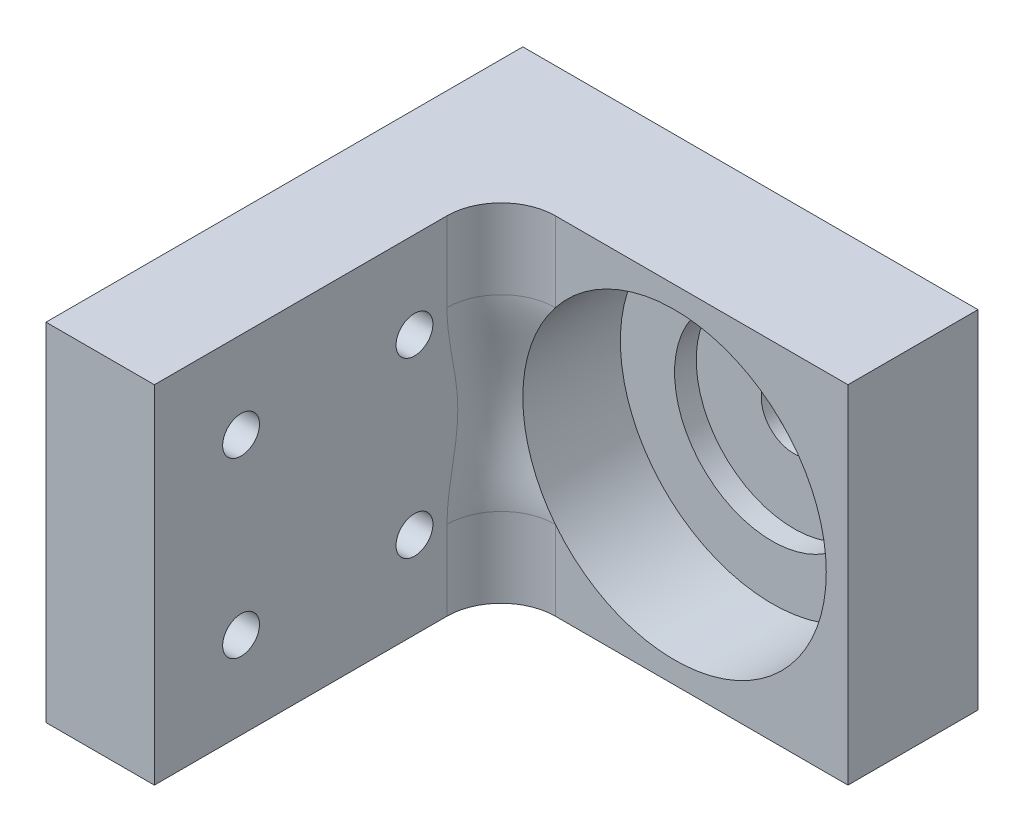
ISO-10303-21;
HEADER;
FILE_DESCRIPTION(('STEP AP214'),'2;1');
FILE_NAME('part.step','',(''),(''),'','','');
FILE_SCHEMA(('AUTOMOTIVE_DESIGN { 1 0 10303 214 1 1 1 1 }'));
ENDSEC;
DATA;
#1=APPLICATION_CONTEXT('core data for automotive mechanical design processes');
#2=APPLICATION_PROTOCOL_DEFINITION('international standard','automotive_design',2000,#1);
#3=PRODUCT_CONTEXT('',#1,'mechanical');
#4=PRODUCT('Part','Part','',(#3));
#5=PRODUCT_RELATED_PRODUCT_CATEGORY('part','',(#4));
#6=PRODUCT_DEFINITION_FORMATION('','',#4);
#7=PRODUCT_DEFINITION_CONTEXT('part definition',#1,'design');
#8=PRODUCT_DEFINITION('design','',#6,#7);
#9=PRODUCT_DEFINITION_SHAPE('','',#8);
#10=(LENGTH_UNIT() NAMED_UNIT(*) SI_UNIT(.MILLI.,.METRE.));
#11=(NAMED_UNIT(*) PLANE_ANGLE_UNIT() SI_UNIT($,.RADIAN.));
#12=(NAMED_UNIT(*) SI_UNIT($,.STERADIAN.) SOLID_ANGLE_UNIT());
#13=UNCERTAINTY_MEASURE_WITH_UNIT(LENGTH_MEASURE(1.E-05),#10,'distance_accuracy_value','');
#14=(GEOMETRIC_REPRESENTATION_CONTEXT(3) GLOBAL_UNCERTAINTY_ASSIGNED_CONTEXT((#13)) GLOBAL_UNIT_ASSIGNED_CONTEXT((#10,
#11,#12)) REPRESENTATION_CONTEXT('',''));
#15=CARTESIAN_POINT('',(0.,0.,0.));
#16=DIRECTION('',(0.,0.,1.));
#17=DIRECTION('',(1.,0.,0.));
#18=AXIS2_PLACEMENT_3D('',#15,#16,#17);
#19=CARTESIAN_POINT('',(0.,0.,12.));
#20=DIRECTION('',(0.,1.,0.));
#21=DIRECTION('',(0.,0.,1.));
#22=AXIS2_PLACEMENT_3D('',#19,#20,#21);
#23=PLANE('',#22);
#24=DIRECTION('',(1.,0.,0.));
#25=VECTOR('',#24,1.);
#26=CARTESIAN_POINT('',(0.,0.,0.));
#27=LINE('',#26,#25);
#28=CARTESIAN_POINT('',(-10.,0.,0.));
#29=VERTEX_POINT('',#28);
#30=CARTESIAN_POINT('',(32.,0.,0.));
#31=VERTEX_POINT('',#30);
#32=EDGE_CURVE('E126',#29,#31,#27,.T.);
#33=ORIENTED_EDGE('',*,*,#32,.T.);
#34=DIRECTION('',(0.,0.,-1.));
#35=VECTOR('',#34,1.);
#36=CARTESIAN_POINT('',(32.,0.,12.));
#37=LINE('',#36,#35);
#38=CARTESIAN_POINT('',(32.,0.,12.));
#39=VERTEX_POINT('',#38);
#40=EDGE_CURVE('E224',#39,#31,#37,.T.);
#41=ORIENTED_EDGE('',*,*,#40,.F.);
#42=DIRECTION('',(1.,0.,0.));
#43=VECTOR('',#42,1.);
#44=CARTESIAN_POINT('',(0.,0.,12.));
#45=LINE('',#44,#43);
#46=CARTESIAN_POINT('',(5.,0.,12.));
#47=VERTEX_POINT('',#46);
#48=EDGE_CURVE('E205',#47,#39,#45,.T.);
#49=ORIENTED_EDGE('',*,*,#48,.F.);
#50=CARTESIAN_POINT('',(5.,0.,17.));
#51=DIRECTION('',(0.,1.,0.));
#52=DIRECTION('',(0.,0.,1.));
#53=AXIS2_PLACEMENT_3D('',#50,#51,#52);
#54=CIRCLE('',#53,5.);
#55=CARTESIAN_POINT('',(0.,0.,17.));
#56=VERTEX_POINT('',#55);
#57=EDGE_CURVE('E63',#47,#56,#54,.T.);
#58=ORIENTED_EDGE('',*,*,#57,.T.);
#59=DIRECTION('',(0.,0.,1.));
#60=VECTOR('',#59,1.);
#61=CARTESIAN_POINT('',(0.,0.,0.));
#62=LINE('',#61,#60);
#63=CARTESIAN_POINT('',(0.,0.,44.));
#64=VERTEX_POINT('',#63);
#65=EDGE_CURVE('E170',#56,#64,#62,.T.);
#66=ORIENTED_EDGE('',*,*,#65,.T.);
#67=DIRECTION('',(1.,0.,0.));
#68=VECTOR('',#67,1.);
#69=CARTESIAN_POINT('',(-10.,0.,44.));
#70=LINE('',#69,#68);
#71=CARTESIAN_POINT('',(-10.,0.,44.));
#72=VERTEX_POINT('',#71);
#73=EDGE_CURVE('E142',#72,#64,#70,.T.);
#74=ORIENTED_EDGE('',*,*,#73,.F.);
#75=DIRECTION('',(0.,0.,1.));
#76=VECTOR('',#75,1.);
#77=CARTESIAN_POINT('',(-10.,0.,0.));
#78=LINE('',#77,#76);
#79=EDGE_CURVE('E140',#29,#72,#78,.T.);
#80=ORIENTED_EDGE('',*,*,#79,.F.);
#81=EDGE_LOOP('',(#33,#41,#49,#58,#66,#74,#80));
#82=FACE_BOUND('',#81,.T.);
#83=ADVANCED_FACE('F48',(#82),#23,.F.);
#84=CARTESIAN_POINT('',(32.,0.,12.));
#85=DIRECTION('',(-1.,0.,0.));
#86=DIRECTION('',(0.,0.,1.));
#87=AXIS2_PLACEMENT_3D('',#84,#85,#86);
#88=PLANE('',#87);
#89=DIRECTION('',(0.,1.,0.));
#90=VECTOR('',#89,1.);
#91=CARTESIAN_POINT('',(32.,0.,0.));
#92=LINE('',#91,#90);
#93=CARTESIAN_POINT('',(32.,32.,0.));
#94=VERTEX_POINT('',#93);
#95=EDGE_CURVE('E132',#31,#94,#92,.T.);
#96=ORIENTED_EDGE('',*,*,#95,.T.);
#97=DIRECTION('',(0.,0.,-1.));
#98=VECTOR('',#97,1.);
#99=CARTESIAN_POINT('',(32.,32.,12.));
#100=LINE('',#99,#98);
#101=CARTESIAN_POINT('',(32.,32.,12.));
#102=VERTEX_POINT('',#101);
#103=EDGE_CURVE('E215',#102,#94,#100,.T.);
#104=ORIENTED_EDGE('',*,*,#103,.F.);
#105=DIRECTION('',(0.,1.,0.));
#106=VECTOR('',#105,1.);
#107=CARTESIAN_POINT('',(32.,0.,12.));
#108=LINE('',#107,#106);
#109=EDGE_CURVE('E208',#39,#102,#108,.T.);
#110=ORIENTED_EDGE('',*,*,#109,.F.);
#111=ORIENTED_EDGE('',*,*,#40,.T.);
#112=EDGE_LOOP('',(#96,#104,#110,#111));
#113=FACE_BOUND('',#112,.T.);
#114=ADVANCED_FACE('F436',(#113),#88,.F.);
#115=CARTESIAN_POINT('',(0.,32.,12.));
#116=DIRECTION('',(0.,-1.,0.));
#117=DIRECTION('',(0.,0.,-1.));
#118=AXIS2_PLACEMENT_3D('',#115,#116,#117);
#119=PLANE('',#118);
#120=DIRECTION('',(-1.,0.,0.));
#121=VECTOR('',#120,1.);
#122=CARTESIAN_POINT('',(0.,32.,0.));
#123=LINE('',#122,#121);
#124=CARTESIAN_POINT('',(-10.,32.,0.));
#125=VERTEX_POINT('',#124);
#126=EDGE_CURVE('E209',#94,#125,#123,.T.);
#127=ORIENTED_EDGE('',*,*,#126,.T.);
#128=DIRECTION('',(0.,0.,-1.));
#129=VECTOR('',#128,1.);
#130=CARTESIAN_POINT('',(-10.,32.,0.));
#131=LINE('',#130,#129);
#132=CARTESIAN_POINT('',(-10.,32.,44.));
#133=VERTEX_POINT('',#132);
#134=EDGE_CURVE('E151',#133,#125,#131,.T.);
#135=ORIENTED_EDGE('',*,*,#134,.F.);
#136=DIRECTION('',(1.,0.,0.));
#137=VECTOR('',#136,1.);
#138=CARTESIAN_POINT('',(-10.,32.,44.));
#139=LINE('',#138,#137);
#140=CARTESIAN_POINT('',(0.,32.,44.));
#141=VERTEX_POINT('',#140);
#142=EDGE_CURVE('E169',#133,#141,#139,.T.);
#143=ORIENTED_EDGE('',*,*,#142,.T.);
#144=DIRECTION('',(0.,0.,-1.));
#145=VECTOR('',#144,1.);
#146=CARTESIAN_POINT('',(0.,32.,0.));
#147=LINE('',#146,#145);
#148=CARTESIAN_POINT('',(0.,32.,17.));
#149=VERTEX_POINT('',#148);
#150=EDGE_CURVE('E153',#141,#149,#147,.T.);
#151=ORIENTED_EDGE('',*,*,#150,.T.);
#152=CARTESIAN_POINT('',(5.,32.,17.));
#153=DIRECTION('',(0.,-1.,0.));
#154=DIRECTION('',(0.,0.,-1.));
#155=AXIS2_PLACEMENT_3D('',#152,#153,#154);
#156=CIRCLE('',#155,5.);
#157=CARTESIAN_POINT('',(5.,32.,12.));
#158=VERTEX_POINT('',#157);
#159=EDGE_CURVE('E11',#149,#158,#156,.T.);
#160=ORIENTED_EDGE('',*,*,#159,.T.);
#161=DIRECTION('',(-1.,0.,0.));
#162=VECTOR('',#161,1.);
#163=CARTESIAN_POINT('',(0.,32.,12.));
#164=LINE('',#163,#162);
#165=EDGE_CURVE('E212',#102,#158,#164,.T.);
#166=ORIENTED_EDGE('',*,*,#165,.F.);
#167=ORIENTED_EDGE('',*,*,#103,.T.);
#168=EDGE_LOOP('',(#127,#135,#143,#151,#160,#166,#167));
#169=FACE_BOUND('',#168,.T.);
#170=ADVANCED_FACE('F420',(#169),#119,.F.);
#171=CARTESIAN_POINT('',(0.,0.,12.));
#172=DIRECTION('',(0.,0.,-1.));
#173=DIRECTION('',(-1.,0.,0.));
#174=AXIS2_PLACEMENT_3D('',#171,#172,#173);
#175=PLANE('',#174);
#176=ORIENTED_EDGE('',*,*,#165,.T.);
#177=DIRECTION('',(0.,-1.,0.));
#178=VECTOR('',#177,1.);
#179=CARTESIAN_POINT('',(5.,0.,12.));
#180=LINE('',#179,#178);
#181=CARTESIAN_POINT('',(5.,24.6602540378444,12.));
#182=VERTEX_POINT('',#181);
#183=EDGE_CURVE('E230',#158,#182,#180,.T.);
#184=ORIENTED_EDGE('',*,*,#183,.T.);
#185=CARTESIAN_POINT('',(16.,16.,12.));
#186=DIRECTION('',(0.,0.,1.));
#187=DIRECTION('',(1.,0.,0.));
#188=AXIS2_PLACEMENT_3D('',#185,#186,#187);
#189=CIRCLE('',#188,14.);
#190=CARTESIAN_POINT('',(5.,7.33974596215561,12.));
#191=VERTEX_POINT('',#190);
#192=EDGE_CURVE('E194',#191,#182,#189,.T.);
#193=ORIENTED_EDGE('',*,*,#192,.F.);
#194=DIRECTION('',(0.,-1.,0.));
#195=VECTOR('',#194,1.);
#196=CARTESIAN_POINT('',(5.,0.,12.));
#197=LINE('',#196,#195);
#198=EDGE_CURVE('E227',#191,#47,#197,.T.);
#199=ORIENTED_EDGE('',*,*,#198,.T.);
#200=ORIENTED_EDGE('',*,*,#48,.T.);
#201=ORIENTED_EDGE('',*,*,#109,.T.);
#202=EDGE_LOOP('',(#176,#184,#193,#199,#200,#201));
#203=FACE_BOUND('',#202,.T.);
#204=ADVANCED_FACE('F265',(#203),#175,.F.);
#205=CARTESIAN_POINT('',(0.,0.,0.));
#206=DIRECTION('',(0.,0.,-1.));
#207=DIRECTION('',(-1.,0.,0.));
#208=AXIS2_PLACEMENT_3D('',#205,#206,#207);
#209=PLANE('',#208);
#210=CARTESIAN_POINT('',(16.,16.,0.));
#211=DIRECTION('',(0.,0.,1.));
#212=DIRECTION('',(1.,0.,0.));
#213=AXIS2_PLACEMENT_3D('',#210,#211,#212);
#214=CIRCLE('',#213,3.);
#215=CARTESIAN_POINT('',(19.,16.,0.));
#216=VERTEX_POINT('',#215);
#217=EDGE_CURVE('E182',#216,#216,#214,.T.);
#218=ORIENTED_EDGE('',*,*,#217,.T.);
#219=EDGE_LOOP('',(#218));
#220=FACE_BOUND('',#219,.T.);
#221=ORIENTED_EDGE('',*,*,#32,.F.);
#222=DIRECTION('',(0.,-1.,0.));
#223=VECTOR('',#222,1.);
#224=CARTESIAN_POINT('',(-10.,32.,0.));
#225=LINE('',#224,#223);
#226=EDGE_CURVE('E131',#125,#29,#225,.T.);
#227=ORIENTED_EDGE('',*,*,#226,.F.);
#228=ORIENTED_EDGE('',*,*,#126,.F.);
#229=ORIENTED_EDGE('',*,*,#95,.F.);
#230=EDGE_LOOP('',(#221,#227,#228,#229));
#231=FACE_BOUND('',#230,.T.);
#232=ADVANCED_FACE('F128',(#220,#231),#209,.T.);
#233=CARTESIAN_POINT('',(16.,16.,3.));
#234=DIRECTION('',(0.,0.,1.));
#235=DIRECTION('',(1.,0.,0.));
#236=AXIS2_PLACEMENT_3D('',#233,#234,#235);
#237=CYLINDRICAL_SURFACE('',#236,14.);
#238=CARTESIAN_POINT('',(16.,16.,3.));
#239=DIRECTION('',(0.,0.,1.));
#240=DIRECTION('',(1.,0.,0.));
#241=AXIS2_PLACEMENT_3D('',#238,#239,#240);
#242=CIRCLE('',#241,14.);
#243=CARTESIAN_POINT('',(30.,16.,3.));
#244=VERTEX_POINT('',#243);
#245=EDGE_CURVE('E137',#244,#244,#242,.T.);
#246=ORIENTED_EDGE('',*,*,#245,.F.);
#247=EDGE_LOOP('',(#246));
#248=FACE_BOUND('',#247,.T.);
#249=EDGE_CURVE('E201',#182,#191,#189,.T.);
#250=ORIENTED_EDGE('',*,*,#249,.T.);
#251=ORIENTED_EDGE('',*,*,#192,.T.);
#252=EDGE_LOOP('',(#250,#251));
#253=FACE_BOUND('',#252,.T.);
#254=ADVANCED_FACE('F268',(#248,#253),#237,.F.);
#255=CARTESIAN_POINT('',(16.,16.,3.));
#256=DIRECTION('',(0.,0.,1.));
#257=DIRECTION('',(1.,0.,0.));
#258=AXIS2_PLACEMENT_3D('',#255,#256,#257);
#259=PLANE('',#258);
#260=CARTESIAN_POINT('',(16.,16.,3.));
#261=DIRECTION('',(0.,0.,1.));
#262=DIRECTION('',(1.,0.,0.));
#263=AXIS2_PLACEMENT_3D('',#260,#261,#262);
#264=CIRCLE('',#263,9.);
#265=CARTESIAN_POINT('',(25.,16.,3.));
#266=VERTEX_POINT('',#265);
#267=EDGE_CURVE('E186',#266,#266,#264,.T.);
#268=ORIENTED_EDGE('',*,*,#267,.F.);
#269=EDGE_LOOP('',(#268));
#270=FACE_BOUND('',#269,.T.);
#271=ORIENTED_EDGE('',*,*,#245,.T.);
#272=EDGE_LOOP('',(#271));
#273=FACE_BOUND('',#272,.T.);
#274=ADVANCED_FACE('F450',(#270,#273),#259,.T.);
#275=CARTESIAN_POINT('',(16.,16.,1.));
#276=DIRECTION('',(0.,0.,1.));
#277=DIRECTION('',(1.,0.,0.));
#278=AXIS2_PLACEMENT_3D('',#275,#276,#277);
#279=CYLINDRICAL_SURFACE('',#278,9.);
#280=CARTESIAN_POINT('',(16.,16.,1.));
#281=DIRECTION('',(0.,0.,1.));
#282=DIRECTION('',(1.,0.,0.));
#283=AXIS2_PLACEMENT_3D('',#280,#281,#282);
#284=CIRCLE('',#283,9.);
#285=CARTESIAN_POINT('',(25.,16.,1.));
#286=VERTEX_POINT('',#285);
#287=EDGE_CURVE('E190',#286,#286,#284,.T.);
#288=ORIENTED_EDGE('',*,*,#287,.F.);
#289=EDGE_LOOP('',(#288));
#290=FACE_BOUND('',#289,.T.);
#291=ORIENTED_EDGE('',*,*,#267,.T.);
#292=EDGE_LOOP('',(#291));
#293=FACE_BOUND('',#292,.T.);
#294=ADVANCED_FACE('F460',(#290,#293),#279,.F.);
#295=CARTESIAN_POINT('',(16.,16.,1.));
#296=DIRECTION('',(0.,0.,1.));
#297=DIRECTION('',(1.,0.,0.));
#298=AXIS2_PLACEMENT_3D('',#295,#296,#297);
#299=PLANE('',#298);
#300=CARTESIAN_POINT('',(16.,16.,1.));
#301=DIRECTION('',(0.,0.,1.));
#302=DIRECTION('',(1.,0.,0.));
#303=AXIS2_PLACEMENT_3D('',#300,#301,#302);
#304=CIRCLE('',#303,3.);
#305=CARTESIAN_POINT('',(19.,16.,1.));
#306=VERTEX_POINT('',#305);
#307=EDGE_CURVE('E181',#306,#306,#304,.T.);
#308=ORIENTED_EDGE('',*,*,#307,.F.);
#309=EDGE_LOOP('',(#308));
#310=FACE_BOUND('',#309,.T.);
#311=ORIENTED_EDGE('',*,*,#287,.T.);
#312=EDGE_LOOP('',(#311));
#313=FACE_BOUND('',#312,.T.);
#314=ADVANCED_FACE('F432',(#310,#313),#299,.T.);
#315=CARTESIAN_POINT('',(16.,16.,0.));
#316=DIRECTION('',(0.,0.,1.));
#317=DIRECTION('',(1.,0.,0.));
#318=AXIS2_PLACEMENT_3D('',#315,#316,#317);
#319=CYLINDRICAL_SURFACE('',#318,3.);
#320=ORIENTED_EDGE('',*,*,#217,.F.);
#321=EDGE_LOOP('',(#320));
#322=FACE_BOUND('',#321,.T.);
#323=ORIENTED_EDGE('',*,*,#307,.T.);
#324=EDGE_LOOP('',(#323));
#325=FACE_BOUND('',#324,.T.);
#326=ADVANCED_FACE('F426',(#322,#325),#319,.F.);
#327=CARTESIAN_POINT('',(-10.,32.,44.));
#328=DIRECTION('',(0.,0.,-1.));
#329=DIRECTION('',(0.,1.,0.));
#330=AXIS2_PLACEMENT_3D('',#327,#328,#329);
#331=PLANE('',#330);
#332=DIRECTION('',(0.,1.,0.));
#333=VECTOR('',#332,1.);
#334=CARTESIAN_POINT('',(0.,32.,44.));
#335=LINE('',#334,#333);
#336=EDGE_CURVE('E159',#64,#141,#335,.T.);
#337=ORIENTED_EDGE('',*,*,#336,.T.);
#338=ORIENTED_EDGE('',*,*,#142,.F.);
#339=DIRECTION('',(0.,1.,0.));
#340=VECTOR('',#339,1.);
#341=CARTESIAN_POINT('',(-10.,32.,44.));
#342=LINE('',#341,#340);
#343=EDGE_CURVE('E146',#72,#133,#342,.T.);
#344=ORIENTED_EDGE('',*,*,#343,.F.);
#345=ORIENTED_EDGE('',*,*,#73,.T.);
#346=EDGE_LOOP('',(#337,#338,#344,#345));
#347=FACE_BOUND('',#346,.T.);
#348=ADVANCED_FACE('F424',(#347),#331,.F.);
#349=CARTESIAN_POINT('',(-10.,0.,0.));
#350=DIRECTION('',(-1.,0.,0.));
#351=DIRECTION('',(0.,0.,1.));
#352=AXIS2_PLACEMENT_3D('',#349,#350,#351);
#353=PLANE('',#352);
#354=CARTESIAN_POINT('',(-10.,8.,20.));
#355=DIRECTION('',(1.,0.,0.));
#356=DIRECTION('',(0.,0.,-1.));
#357=AXIS2_PLACEMENT_3D('',#354,#355,#356);
#358=CIRCLE('',#357,1.7);
#359=CARTESIAN_POINT('',(-10.,8.,18.3));
#360=VERTEX_POINT('',#359);
#361=EDGE_CURVE('E277',#360,#360,#358,.T.);
#362=ORIENTED_EDGE('',*,*,#361,.T.);
#363=EDGE_LOOP('',(#362));
#364=FACE_BOUND('',#363,.T.);
#365=CARTESIAN_POINT('',(-10.,8.,36.));
#366=DIRECTION('',(1.,0.,0.));
#367=DIRECTION('',(0.,0.,-1.));
#368=AXIS2_PLACEMENT_3D('',#365,#366,#367);
#369=CIRCLE('',#368,1.7);
#370=CARTESIAN_POINT('',(-10.,8.,34.3));
#371=VERTEX_POINT('',#370);
#372=EDGE_CURVE('E369',#371,#371,#369,.T.);
#373=ORIENTED_EDGE('',*,*,#372,.T.);
#374=EDGE_LOOP('',(#373));
#375=FACE_BOUND('',#374,.T.);
#376=CARTESIAN_POINT('',(-10.,24.,36.));
#377=DIRECTION('',(1.,0.,0.));
#378=DIRECTION('',(0.,0.,-1.));
#379=AXIS2_PLACEMENT_3D('',#376,#377,#378);
#380=CIRCLE('',#379,1.7);
#381=CARTESIAN_POINT('',(-10.,24.,34.3));
#382=VERTEX_POINT('',#381);
#383=EDGE_CURVE('E357',#382,#382,#380,.T.);
#384=ORIENTED_EDGE('',*,*,#383,.T.);
#385=EDGE_LOOP('',(#384));
#386=FACE_BOUND('',#385,.T.);
#387=CARTESIAN_POINT('',(-10.,24.,20.));
#388=DIRECTION('',(1.,0.,0.));
#389=DIRECTION('',(0.,0.,-1.));
#390=AXIS2_PLACEMENT_3D('',#387,#388,#389);
#391=CIRCLE('',#390,1.7);
#392=CARTESIAN_POINT('',(-10.,24.,18.3));
#393=VERTEX_POINT('',#392);
#394=EDGE_CURVE('E173',#393,#393,#391,.T.);
#395=ORIENTED_EDGE('',*,*,#394,.T.);
#396=EDGE_LOOP('',(#395));
#397=FACE_BOUND('',#396,.T.);
#398=ORIENTED_EDGE('',*,*,#226,.T.);
#399=ORIENTED_EDGE('',*,*,#79,.T.);
#400=ORIENTED_EDGE('',*,*,#343,.T.);
#401=ORIENTED_EDGE('',*,*,#134,.T.);
#402=EDGE_LOOP('',(#398,#399,#400,#401));
#403=FACE_BOUND('',#402,.T.);
#404=ADVANCED_FACE('F149',(#364,#375,#386,#397,#403),#353,.T.);
#405=CARTESIAN_POINT('',(0.,0.,0.));
#406=DIRECTION('',(-1.,0.,0.));
#407=DIRECTION('',(0.,0.,1.));
#408=AXIS2_PLACEMENT_3D('',#405,#406,#407);
#409=PLANE('',#408);
#410=CARTESIAN_POINT('',(0.,8.,20.));
#411=DIRECTION('',(1.,0.,0.));
#412=DIRECTION('',(0.,0.,-1.));
#413=AXIS2_PLACEMENT_3D('',#410,#411,#412);
#414=CIRCLE('',#413,1.7);
#415=CARTESIAN_POINT('',(0.,8.,18.3));
#416=VERTEX_POINT('',#415);
#417=EDGE_CURVE('E375',#416,#416,#414,.T.);
#418=ORIENTED_EDGE('',*,*,#417,.F.);
#419=EDGE_LOOP('',(#418));
#420=FACE_BOUND('',#419,.T.);
#421=CARTESIAN_POINT('',(0.,8.,36.));
#422=DIRECTION('',(1.,0.,0.));
#423=DIRECTION('',(0.,0.,-1.));
#424=AXIS2_PLACEMENT_3D('',#421,#422,#423);
#425=CIRCLE('',#424,1.7);
#426=CARTESIAN_POINT('',(0.,8.,34.3));
#427=VERTEX_POINT('',#426);
#428=EDGE_CURVE('E363',#427,#427,#425,.T.);
#429=ORIENTED_EDGE('',*,*,#428,.F.);
#430=EDGE_LOOP('',(#429));
#431=FACE_BOUND('',#430,.T.);
#432=CARTESIAN_POINT('',(0.,24.,36.));
#433=DIRECTION('',(1.,0.,0.));
#434=DIRECTION('',(0.,0.,-1.));
#435=AXIS2_PLACEMENT_3D('',#432,#433,#434);
#436=CIRCLE('',#435,1.7);
#437=CARTESIAN_POINT('',(0.,24.,34.3));
#438=VERTEX_POINT('',#437);
#439=EDGE_CURVE('E352',#438,#438,#436,.T.);
#440=ORIENTED_EDGE('',*,*,#439,.F.);
#441=EDGE_LOOP('',(#440));
#442=FACE_BOUND('',#441,.T.);
#443=CARTESIAN_POINT('',(0.,24.,20.));
#444=DIRECTION('',(1.,0.,0.));
#445=DIRECTION('',(0.,0.,-1.));
#446=AXIS2_PLACEMENT_3D('',#443,#444,#445);
#447=CIRCLE('',#446,1.7);
#448=CARTESIAN_POINT('',(0.,24.,18.3));
#449=VERTEX_POINT('',#448);
#450=EDGE_CURVE('E162',#449,#449,#447,.T.);
#451=ORIENTED_EDGE('',*,*,#450,.F.);
#452=EDGE_LOOP('',(#451));
#453=FACE_BOUND('',#452,.T.);
#454=ORIENTED_EDGE('',*,*,#65,.F.);
#455=DIRECTION('',(0.,-1.,0.));
#456=VECTOR('',#455,1.);
#457=CARTESIAN_POINT('',(0.,32.,17.));
#458=LINE('',#457,#456);
#459=CARTESIAN_POINT('',(0.,7.33974596215561,17.));
#460=VERTEX_POINT('',#459);
#461=EDGE_CURVE('E71',#56,#460,#458,.F.);
#462=ORIENTED_EDGE('',*,*,#461,.T.);
#463=CARTESIAN_POINT('',(6.310010073384,26.1046571056162,12.));
#464=CARTESIAN_POINT('',(0.,25.6196788061528,10.3570053610344));
#465=CARTESIAN_POINT('',(0.,27.4707267840155,16.6279290445501));
#466=CARTESIAN_POINT('',(6.197980099759,25.997199756795,12.));
#467=CARTESIAN_POINT('',(0.,25.621019516144,10.5186568687843));
#468=CARTESIAN_POINT('',(0.,27.2159817034711,16.7031086424599));
#469=CARTESIAN_POINT('',(6.08216988216947,25.8825884614474,12.));
#470=CARTESIAN_POINT('',(0.,25.5927455294439,10.6848089286202));
#471=CARTESIAN_POINT('',(0.,26.9577544077632,16.7653696778037));
#472=CARTESIAN_POINT('',(5.84460873306768,25.6383178462577,12.));
#473=CARTESIAN_POINT('',(0.,25.4825836361439,11.0115690688025));
#474=CARTESIAN_POINT('',(0.,26.4369151392631,16.8666880299089));
#475=CARTESIAN_POINT('',(5.7228617084183,25.5086683472453,12.));
#476=CARTESIAN_POINT('',(0.,25.4022734448711,11.1723016113875));
#477=CARTESIAN_POINT('',(0.,26.174306122876,16.905760389378));
#478=CARTESIAN_POINT('',(5.47567861422405,25.2343110614203,12.));
#479=CARTESIAN_POINT('',(0.,25.196534613685,11.4794716223642));
#480=CARTESIAN_POINT('',(0.,25.6486079049466,16.9632437895512));
#481=CARTESIAN_POINT('',(5.35027063143913,25.0897033311911,12.));
#482=CARTESIAN_POINT('',(0.,25.0726277868666,11.6263528376755));
#483=CARTESIAN_POINT('',(0.,25.3855321614173,16.9817834984404));
#484=CARTESIAN_POINT('',(5.16013671996629,24.8604297503819,12.));
#485=CARTESIAN_POINT('',(0.,24.8573847758795,11.835070179743));
#486=CARTESIAN_POINT('',(0.,24.990553790579,16.9964500544909));
#487=CARTESIAN_POINT('',(5.09643086107966,24.781956797069,12.));
#488=CARTESIAN_POINT('',(0.,24.781637432407,11.902105055338));
#489=CARTESIAN_POINT('',(0.,24.858852088102,16.9991489493856));
#490=CARTESIAN_POINT('',(4.96856089655515,24.6207847515569,12.));
#491=CARTESIAN_POINT('',(0.,24.6217954426302,12.0316466395543));
#492=CARTESIAN_POINT('',(0.,24.5954524574169,17.000506911144));
#493=CARTESIAN_POINT('',(4.90439688106364,24.5380864720338,12.));
#494=CARTESIAN_POINT('',(0.,24.537796688697,12.0942212508028));
#495=CARTESIAN_POINT('',(0.,24.4637545333212,16.9991667520032));
#496=CARTESIAN_POINT('',(4.70305695533321,24.2722798189634,12.));
#497=CARTESIAN_POINT('',(0.,24.2647699078543,12.2814942947291));
#498=CARTESIAN_POINT('',(0.,24.0514408722085,16.9891708659018));
#499=CARTESIAN_POINT('',(4.56543523773884,24.0814575697573,12.));
#500=CARTESIAN_POINT('',(0.,24.060903365113,12.3996484556295));
#501=CARTESIAN_POINT('',(0.,23.7709745909697,16.9739522745136));
#502=CARTESIAN_POINT('',(4.29141822519171,23.6790871026136,12.));
#503=CARTESIAN_POINT('',(0.,23.6251363939061,12.6137344094582));
#504=CARTESIAN_POINT('',(0.,23.2110842322535,16.9299447252645));
#505=CARTESIAN_POINT('',(4.15502338657152,23.4675314949061,12.));
#506=CARTESIAN_POINT('',(0.,23.3936531652719,12.7103131153552));
#507=CARTESIAN_POINT('',(0.,22.9316605634884,16.9011509148971));
#508=CARTESIAN_POINT('',(3.88587951580984,23.0225225588144,12.));
#509=CARTESIAN_POINT('',(0.,22.9077739591419,12.8824019107903));
#510=CARTESIAN_POINT('',(0.,22.3735649122452,16.8332273327277));
#511=CARTESIAN_POINT('',(3.7531379523462,22.7890281390693,12.));
#512=CARTESIAN_POINT('',(0.,22.6534836280408,12.9584637347684));
#513=CARTESIAN_POINT('',(0.,22.0948953881744,16.7940779056185));
#514=CARTESIAN_POINT('',(3.49452500707302,22.2999676601558,12.));
#515=CARTESIAN_POINT('',(0.,22.1267276233098,13.0912154102512));
#516=CARTESIAN_POINT('',(0.,21.5386690348665,16.7088879643239));
#517=CARTESIAN_POINT('',(3.36865299605437,22.0444036279851,12.));
#518=CARTESIAN_POINT('',(0.,21.8541883108917,13.1484022225197));
#519=CARTESIAN_POINT('',(0.,21.2611121058874,16.6628480827125));
#520=CARTESIAN_POINT('',(3.12716709642804,21.5114090858558,12.));
#521=CARTESIAN_POINT('',(0.,21.2946308024391,13.2459029114767));
#522=CARTESIAN_POINT('',(0.,20.706974715288,16.5675283837794));
#523=CARTESIAN_POINT('',(3.01153892825205,21.2340100659597,12.));
#524=CARTESIAN_POINT('',(0.,21.0073595546561,13.2866283015225));
#525=CARTESIAN_POINT('',(0.,20.4303934273831,16.5182532487137));
#526=CARTESIAN_POINT('',(2.79382874589018,20.65746289362,12.));
#527=CARTESIAN_POINT('',(0.,20.4205419564578,13.3542440616686));
#528=CARTESIAN_POINT('',(0.,19.8771255484204,16.4202113526191));
#529=CARTESIAN_POINT('',(2.6917473458141,20.3583137561386,12.));
#530=CARTESIAN_POINT('',(0.,20.1205258288904,13.3814183750604));
#531=CARTESIAN_POINT('',(0.,19.6004389531584,16.3714446147293));
#532=CARTESIAN_POINT('',(2.50499978135255,19.7401821527165,12.));
#533=CARTESIAN_POINT('',(0.,19.5109132283524,13.4249971453354));
#534=CARTESIAN_POINT('',(0.,19.0467732617209,16.278557553199));
#535=CARTESIAN_POINT('',(2.42030274044061,19.42123618413,12.));
#536=CARTESIAN_POINT('',(0.,19.2006964160542,13.4416087510214));
#537=CARTESIAN_POINT('',(0.,18.769795577937,16.2344290607745));
#538=CARTESIAN_POINT('',(2.2717892595748,18.7656984908941,12.));
#539=CARTESIAN_POINT('',(0.,18.5723038477139,13.467188525612));
#540=CARTESIAN_POINT('',(0.,18.2145687626363,16.1548460720052));
#541=CARTESIAN_POINT('',(2.20797176318123,18.4291076600198,12.));
#542=CARTESIAN_POINT('',(0.,18.253312514792,13.4762668999251));
#543=CARTESIAN_POINT('',(0.,17.9363196961699,16.1193911368284));
#544=CARTESIAN_POINT('',(2.10387529307057,17.7381700845132,12.));
#545=CARTESIAN_POINT('',(0.,17.6057085488642,13.4895544426252));
#546=CARTESIAN_POINT('',(0.,17.3748476370286,16.0605839755421));
#547=CARTESIAN_POINT('',(2.0639119955132,17.3836497941397,12.));
#548=CARTESIAN_POINT('',(0.,17.2759937616507,13.4937544002001));
#549=CARTESIAN_POINT('',(0.,17.0916069083719,16.0373945028966));
#550=CARTESIAN_POINT('',(2.01131066767315,16.6674013290152,12.));
#551=CARTESIAN_POINT('',(0.,16.6142463405083,13.4990282965458));
#552=CARTESIAN_POINT('',(0.,16.524274363517,16.0067114664417));
#553=CARTESIAN_POINT('',(1.99866927740185,16.3056740460868,12.));
#554=CARTESIAN_POINT('',(0.,16.2810855653687,13.5001219722189));
#555=CARTESIAN_POINT('',(0.,16.2401826562737,15.9992159726247));
#556=CARTESIAN_POINT('',(2.00155410317264,15.5824810357097,12.));
#557=CARTESIAN_POINT('',(0.,15.6159966221529,13.4998575577099));
#558=CARTESIAN_POINT('',(0.,15.6719384911324,16.0009156603507));
#559=CARTESIAN_POINT('',(2.01709151293828,15.2210154692891,12.));
#560=CARTESIAN_POINT('',(0.,15.2828977544911,13.4984975837232));
#561=CARTESIAN_POINT('',(0.,15.3877860539456,16.0101174747197));
#562=CARTESIAN_POINT('',(2.07531653005888,14.506032444696,12.));
#563=CARTESIAN_POINT('',(0.,14.6216234354609,13.4925448905199));
#564=CARTESIAN_POINT('',(0.,14.820409551766,16.0440028551566));
#565=CARTESIAN_POINT('',(2.11800763238039,14.1525160157267,12.));
#566=CARTESIAN_POINT('',(0.,14.2923278364798,13.4879296131026));
#567=CARTESIAN_POINT('',(0.,14.5371856109979,16.06868841414));
#568=CARTESIAN_POINT('',(2.22815691901373,13.4582485076234,12.));
#569=CARTESIAN_POINT('',(0.,13.6402574505303,13.4734410746345));
#570=CARTESIAN_POINT('',(0.,13.9709595051113,16.1306318508592));
#571=CARTESIAN_POINT('',(2.29571895779416,13.11755765684,12.));
#572=CARTESIAN_POINT('',(0.,13.3165199619383,13.4634848912179));
#573=CARTESIAN_POINT('',(0.,13.6879633301063,16.1679423936336));
#574=CARTESIAN_POINT('',(2.45200747206493,12.4548778534337,12.));
#575=CARTESIAN_POINT('',(0.,12.6792336566467,13.4355290029918));
#576=CARTESIAN_POINT('',(0.,13.1232432134471,16.2510283671254));
#577=CARTESIAN_POINT('',(2.54073519666574,12.1328900059792,12.));
#578=CARTESIAN_POINT('',(0.,12.3648470504423,13.4174040671088));
#579=CARTESIAN_POINT('',(0.,12.8415193478794,16.2968042973989));
#580=CARTESIAN_POINT('',(2.73548896318604,11.5100886996188,12.));
#581=CARTESIAN_POINT('',(0.,11.7479806922063,13.370036649683));
#582=CARTESIAN_POINT('',(0.,12.2786718420558,16.3924871057532));
#583=CARTESIAN_POINT('',(2.84152241611163,11.209284391703,12.));
#584=CARTESIAN_POINT('',(0.,11.4448536402147,13.3405777667243));
#585=CARTESIAN_POINT('',(0.,11.9975485114561,16.4423957490965));
#586=CARTESIAN_POINT('',(3.06699511615314,10.6302755277473,12.));
#587=CARTESIAN_POINT('',(0.,10.8525815622516,13.26749963918));
#588=CARTESIAN_POINT('',(0.,11.4353000418146,16.5421021526895));
#589=CARTESIAN_POINT('',(3.18643339126307,10.3520693355987,12.));
#590=CARTESIAN_POINT('',(0.,10.5629731045096,13.2235659389606));
#591=CARTESIAN_POINT('',(0.,11.1541749043801,16.5918999207123));
#592=CARTESIAN_POINT('',(3.36854174501052,9.96137731478885,12.));
#593=CARTESIAN_POINT('',(0.,10.152836680359,13.1472051993886));
#594=CARTESIAN_POINT('',(0.,10.7419162063258,16.661865249038));
#595=CARTESIAN_POINT('',(3.42737112849225,9.83990796553422,12.));
#596=CARTESIAN_POINT('',(0.,10.0238051815873,13.1209672161861));
#597=CARTESIAN_POINT('',(0.,10.6110562546587,16.6836231248026));
#598=CARTESIAN_POINT('',(3.54680170032124,9.60190847160743,12.));
#599=CARTESIAN_POINT('',(0.,9.76955856715138,13.0645508677728));
#600=CARTESIAN_POINT('',(0.,10.3491472785711,16.7258864564276));
#601=CARTESIAN_POINT('',(3.60740272475334,9.48537787242242,12.));
#602=CARTESIAN_POINT('',(0.,9.64432701018609,13.034325000555));
#603=CARTESIAN_POINT('',(0.,10.2180982727022,16.7463920276142));
#604=CARTESIAN_POINT('',(3.79117930412169,9.14349971138446,12.));
#605=CARTESIAN_POINT('',(0.,9.27346664837611,12.9369987062666));
#606=CARTESIAN_POINT('',(0.,9.82499988596915,16.805414668215));
#607=CARTESIAN_POINT('',(3.91651773130252,8.92546435373202,12.));
#608=CARTESIAN_POINT('',(0.,9.03579577593917,12.8637889784193));
#609=CARTESIAN_POINT('',(0.,9.56257564534311,16.8415119875683));
#610=CARTESIAN_POINT('',(4.17022672389309,8.50895259724266,12.));
#611=CARTESIAN_POINT('',(0.,8.58093405299615,12.6996339070384));
#612=CARTESIAN_POINT('',(0.,9.03720679118081,16.9043269497266));
#613=CARTESIAN_POINT('',(4.29858939696546,8.31043105734028,12.));
#614=CARTESIAN_POINT('',(0.,8.36382844295636,12.608234506587));
#615=CARTESIAN_POINT('',(0.,8.77426488598827,16.9310666250857));
#616=CARTESIAN_POINT('',(4.55653553914149,7.93156277737025,12.));
#617=CARTESIAN_POINT('',(0.,7.95349004552222,12.4067994893645));
#618=CARTESIAN_POINT('',(0.,8.24720813283169,16.9725525777537));
#619=CARTESIAN_POINT('',(4.68611981026542,7.75122904082245,12.));
#620=CARTESIAN_POINT('',(0.,7.76063568599562,12.2962076541419));
#621=CARTESIAN_POINT('',(0.,7.98309258465602,16.9872903267027));
#622=CARTESIAN_POINT('',(4.9445086630257,7.40801036102494,12.));
#623=CARTESIAN_POINT('',(0.,7.4040667793636,12.0566405874258));
#624=CARTESIAN_POINT('',(0.,7.4542278284443,17.002015737062));
#625=CARTESIAN_POINT('',(5.07331269193374,7.24513667100741,12.));
#626=CARTESIAN_POINT('',(0.,7.2409819875369,11.9270925797601));
#627=CARTESIAN_POINT('',(0.,7.18947832284482,17.0019939422388));
#628=CARTESIAN_POINT('',(5.32813294658597,6.93626491218886,12.));
#629=CARTESIAN_POINT('',(0.,6.95041413298799,11.6515815692338));
#630=CARTESIAN_POINT('',(0.,6.66073449061614,16.9844546462966));
#631=CARTESIAN_POINT('',(5.45415143515399,6.79025270560027,12.));
#632=CARTESIAN_POINT('',(0.,6.82378891426135,11.5051081921921));
#633=CARTESIAN_POINT('',(0.,6.39673971500635,16.9669519229348));
#634=CARTESIAN_POINT('',(5.70482420031326,6.51077071480999,12.));
#635=CARTESIAN_POINT('',(0.,6.61052579420705,11.1955865910927));
#636=CARTESIAN_POINT('',(0.,5.86442861743018,16.9110789804844));
#637=CARTESIAN_POINT('',(5.82937283968544,6.37768686766813,12.));
#638=CARTESIAN_POINT('',(0.,6.5262761392595,11.0319057848451));
#639=CARTESIAN_POINT('',(0.,5.59616098815884,16.8722171875872));
#640=CARTESIAN_POINT('',(6.07259467859502,6.12695240716176,12.));
#641=CARTESIAN_POINT('',(0.,6.40993158504561,10.6983616438479));
#642=CARTESIAN_POINT('',(0.,5.06354444308173,16.7703311776779));
#643=CARTESIAN_POINT('',(6.1912508914668,6.00934496390589,12.));
#644=CARTESIAN_POINT('',(0.,6.37962468756047,10.5283513580672));
#645=CARTESIAN_POINT('',(0.,4.79920823990166,16.7072412194188));
#646=CARTESIAN_POINT('',(6.30595248905162,5.8992355311355,12.));
#647=CARTESIAN_POINT('',(0.,6.38029789223174,10.3629336165759));
#648=CARTESIAN_POINT('',(0.,4.53849137503757,16.6306439550008));
#649=(BOUNDED_SURFACE() B_SPLINE_SURFACE(3,2,((#463,#464,#465),(#466,#467,#468),(#469,#470,
#471),(#472,#473,#474),(#475,#476,#477),(#478,#479,#480),(#481,#482,#483),(#484,#485,#486),
(#487,#488,#489),(#490,#491,#492),(#493,#494,#495),(#496,#497,#498),(#499,#500,#501),(#502,#503,
#504),(#505,#506,#507),(#508,#509,#510),(#511,#512,#513),(#514,#515,#516),(#517,#518,#519),
(#520,#521,#522),(#523,#524,#525),(#526,#527,#528),(#529,#530,#531),(#532,#533,#534),(#535,#536,
#537),(#538,#539,#540),(#541,#542,#543),(#544,#545,#546),(#547,#548,#549),(#550,#551,#552),
(#553,#554,#555),(#556,#557,#558),(#559,#560,#561),(#562,#563,#564),(#565,#566,#567),(#568,#569,
#570),(#571,#572,#573),(#574,#575,#576),(#577,#578,#579),(#580,#581,#582),(#583,#584,#585),
(#586,#587,#588),(#589,#590,#591),(#592,#593,#594),(#595,#596,#597),(#598,#599,#600),(#601,#602,
#603),(#604,#605,#606),(#607,#608,#609),(#610,#611,#612),(#613,#614,#615),(#616,#617,#618),
(#619,#620,#621),(#622,#623,#624),(#625,#626,#627),(#628,#629,#630),(#631,#632,#633),(#634,#635,
#636),(#637,#638,#639),(#640,#641,#642),(#643,#644,#645),(#646,#647,#648)),.UNSPECIFIED.,.F.,
.F.,.F.) B_SPLINE_SURFACE_WITH_KNOTS((4,2,2,2,2,2,2,2,2,2,2,2,2,2,2,2,2,2,2,2,2,2,2,2,2,2,2,2,2,
2,4),(3,3),(0.,0.796023729454611,1.59153050492739,2.38202351072558,2.77715889217095,
3.17221855944791,4.01438923668521,4.85686117909403,5.7009437805325,6.54494893894975,
7.38775843648958,8.23060612770804,9.07194362201752,9.91323854069377,10.7654332358184,
11.6175231239324,12.4699515696805,13.3224897541657,14.1786290605159,15.0348189051416,
15.8913763712697,16.7478717670683,17.1458353122064,17.5437621529023,18.3383262152876,
19.1310066883667,19.9242499361179,20.7180014042271,21.5110824304607,22.3232304874211,
23.1375979962178),(0.,1.),
.UNSPECIFIED.) GEOMETRIC_REPRESENTATION_ITEM() RATIONAL_B_SPLINE_SURFACE(((1.,0.607452872790639,
1.),(1.,0.616678227127903,1.),(1.,0.625996608082364,1.),(1.,0.644689930389202,1.),(1.,
0.654064831080111,1.),(1.,0.672695107478413,1.),(1.,0.681950864106988,1.),(1.,0.695706387328535,
1.),(1.,0.700269577056533,1.),(1.,0.709340882776317,1.),(1.,0.713849009153553,1.),(1.,
0.727863417689758,1.),(1.,0.737252063231149,1.),(1.,0.755607376728043,1.),(1.,0.764573892530346,
1.),(1.,0.781976921304095,1.),(1.,0.790412388229522,1.),(1.,0.806605898488534,1.),(1.,
0.814364003903477,1.),(1.,0.82905803000681,1.),(1.,0.835995099874393,1.),(1.,0.848916311793765,
1.),(1.,0.854900410647388,1.),(1.,0.865753701737108,1.),(1.,0.870624872427837,1.),(1.,
0.879112707893556,1.),(1.,0.882729436139969,1.),(1.,0.88860638535598,1.),(1.,0.890848424390606,
1.),(1.,0.893795928560234,1.),(1.,0.894501582636588,1.),(1.,0.894340311965311,1.),(1.,
0.893472762279518,1.),(1.,0.890208372523159,1.),(1.,0.887811335591333,1.),(1.,0.8815860445926,
1.),(1.,0.87775178783192,1.),(1.,0.868803311217947,1.),(1.,0.863689015821238,1.),(1.,
0.852339879038537,1.),(1.,0.846104557467531,1.),(1.,0.832673716620471,1.),(1.,0.825478266957766,
1.),(1.,0.81434533895517,1.),(1.,0.810725955373544,1.),(1.,0.803326532691698,1.),(1.,
0.799546508439632,1.),(1.,0.78799822026911,1.),(1.,0.780010204961232,1.),(1.,0.763573647411435,
1.),(1.,0.755126241782598,1.),(1.,0.737848979978254,1.),(1.,0.729018856534498,1.),(1.,
0.711076385218665,1.),(1.,0.701963860153749,1.),(1.,0.683572451959252,1.),(1.,0.674293715845123,
1.),(1.,0.655444943445507,1.),(1.,0.645873266952,1.),(1.,0.626764350400764,1.),(1.,
0.617227275935538,1.),(1.,0.607786764494619,1.))) REPRESENTATION_ITEM('') SURFACE());
#650=CARTESIAN_POINT('',(0.,4.53849137503757,16.6306439550008));
#651=CARTESIAN_POINT('',(0.,4.79920823990166,16.7072412194188));
#652=CARTESIAN_POINT('',(0.,5.06354444308173,16.7703311776779));
#653=CARTESIAN_POINT('',(0.,5.59616098815884,16.8722171875872));
#654=CARTESIAN_POINT('',(0.,5.86442861743018,16.9110789804844));
#655=CARTESIAN_POINT('',(0.,6.39673971500635,16.9669519229348));
#656=CARTESIAN_POINT('',(0.,6.66073449061614,16.9844546462966));
#657=CARTESIAN_POINT('',(0.,7.18947832284482,17.0019939422388));
#658=CARTESIAN_POINT('',(0.,7.4542278284443,17.002015737062));
#659=CARTESIAN_POINT('',(0.,7.98309258465602,16.9872903267027));
#660=CARTESIAN_POINT('',(0.,8.24720813283169,16.9725525777537));
#661=CARTESIAN_POINT('',(0.,8.77426488598827,16.9310666250857));
#662=CARTESIAN_POINT('',(0.,9.03720679118081,16.9043269497266));
#663=CARTESIAN_POINT('',(0.,9.56257564534311,16.8415119875683));
#664=CARTESIAN_POINT('',(0.,9.82499988596915,16.805414668215));
#665=CARTESIAN_POINT('',(0.,10.2180982727022,16.7463920276142));
#666=CARTESIAN_POINT('',(0.,10.3491472785711,16.7258864564276));
#667=CARTESIAN_POINT('',(0.,10.6110562546587,16.6836231248027));
#668=CARTESIAN_POINT('',(0.,10.7419162063258,16.661865249038));
#669=CARTESIAN_POINT('',(0.,11.1541749043801,16.5918999207123));
#670=CARTESIAN_POINT('',(0.,11.4353000418146,16.5421021526895));
#671=CARTESIAN_POINT('',(0.,11.9975485114561,16.4423957490965));
#672=CARTESIAN_POINT('',(0.,12.2786718420558,16.3924871057532));
#673=CARTESIAN_POINT('',(0.,12.8415193478794,16.2968042973989));
#674=CARTESIAN_POINT('',(0.,13.1232432134471,16.2510283671254));
#675=CARTESIAN_POINT('',(0.,13.6879633301063,16.1679423936336));
#676=CARTESIAN_POINT('',(0.,13.9709595051113,16.1306318508592));
#677=CARTESIAN_POINT('',(0.,14.5371856109979,16.06868841414));
#678=CARTESIAN_POINT('',(0.,14.820409551766,16.0440028551566));
#679=CARTESIAN_POINT('',(0.,15.3877860539456,16.0101174747197));
#680=CARTESIAN_POINT('',(0.,15.6719384911324,16.0009156603507));
#681=CARTESIAN_POINT('',(0.,16.2401826562737,15.9992159726247));
#682=CARTESIAN_POINT('',(0.,16.524274363517,16.0067114664417));
#683=CARTESIAN_POINT('',(0.,17.0916069083719,16.0373945028966));
#684=CARTESIAN_POINT('',(0.,17.3748476370286,16.0605839755421));
#685=CARTESIAN_POINT('',(0.,17.9363196961699,16.1193911368284));
#686=CARTESIAN_POINT('',(0.,18.2145687626363,16.1548460720052));
#687=CARTESIAN_POINT('',(0.,18.769795577937,16.2344290607745));
#688=CARTESIAN_POINT('',(0.,19.0467732617209,16.278557553199));
#689=CARTESIAN_POINT('',(0.,19.6004389531584,16.3714446147293));
#690=CARTESIAN_POINT('',(0.,19.8771255484204,16.4202113526191));
#691=CARTESIAN_POINT('',(0.,20.4303934273831,16.5182532487137));
#692=CARTESIAN_POINT('',(0.,20.706974715288,16.5675283837794));
#693=CARTESIAN_POINT('',(0.,21.2611121058874,16.6628480827125));
#694=CARTESIAN_POINT('',(0.,21.5386690348665,16.7088879643239));
#695=CARTESIAN_POINT('',(0.,22.0948953881744,16.7940779056185));
#696=CARTESIAN_POINT('',(0.,22.3735649122452,16.8332273327277));
#697=CARTESIAN_POINT('',(0.,22.9316605634884,16.9011509148971));
#698=CARTESIAN_POINT('',(0.,23.2110842322535,16.9299447252645));
#699=CARTESIAN_POINT('',(0.,23.7709745909697,16.9739522745136));
#700=CARTESIAN_POINT('',(0.,24.0514408722085,16.9891708659018));
#701=CARTESIAN_POINT('',(0.,24.4637545333212,16.9991667520032));
#702=CARTESIAN_POINT('',(0.,24.5954524574169,17.000506911144));
#703=CARTESIAN_POINT('',(0.,24.858852088102,16.9991489493856));
#704=CARTESIAN_POINT('',(0.,24.990553790579,16.9964500544909));
#705=CARTESIAN_POINT('',(0.,25.3855321614173,16.9817834984404));
#706=CARTESIAN_POINT('',(0.,25.6486079049466,16.9632437895512));
#707=CARTESIAN_POINT('',(0.,26.174306122876,16.905760389378));
#708=CARTESIAN_POINT('',(0.,26.4369151392631,16.8666880299089));
#709=CARTESIAN_POINT('',(0.,26.9577544077632,16.7653696778037));
#710=CARTESIAN_POINT('',(0.,27.2159817034711,16.7031086424599));
#711=CARTESIAN_POINT('',(0.,27.4707267840155,16.6279290445501));
#712=B_SPLINE_CURVE_WITH_KNOTS('',3,(#650,#651,#652,#653,#654,#655,#656,#657,#658,#659,#660,
#661,#662,#663,#664,#665,#666,#667,#668,#669,#670,#671,#672,#673,#674,#675,#676,#677,#678,#679,
#680,#681,#682,#683,#684,#685,#686,#687,#688,#689,#690,#691,#692,#693,#694,#695,#696,#697,#698,
#699,#700,#701,#702,#703,#704,#705,#706,#707,#708,#709,#710,#711),.UNSPECIFIED.,.F.,.F.,(4,2,2,
2,2,2,2,2,2,2,2,2,2,2,2,2,2,2,2,2,2,2,2,2,2,2,2,2,2,2,4),(0.,0.814367508796647,1.62651556575709,
2.41959659199073,3.21334806009993,4.0065913078511,4.79927178093022,5.59383584331547,
5.99176268401142,6.38972622914949,7.24622162494805,8.10277909107622,8.95896893570187,
9.81510824205212,10.6676464265373,11.5200748722854,12.3721647603994,13.224359455524,
14.0656543742003,14.9069918685097,15.7498395597282,16.592649057268,17.4366542156853,
18.2807368171238,19.1232087595326,19.9653794367699,20.3604391040468,20.7555744854922,
21.5460674912904,22.3415742667632,23.1375979962178),.UNSPECIFIED.);
#713=CARTESIAN_POINT('',(0.,24.6602540378444,17.));
#714=VERTEX_POINT('',#713);
#715=EDGE_CURVE('E76',#460,#714,#712,.T.);
#716=ORIENTED_EDGE('',*,*,#715,.T.);
#717=DIRECTION('',(0.,-1.,0.));
#718=VECTOR('',#717,1.);
#719=CARTESIAN_POINT('',(0.,32.,17.));
#720=LINE('',#719,#718);
#721=EDGE_CURVE('E234',#714,#149,#720,.F.);
#722=ORIENTED_EDGE('',*,*,#721,.T.);
#723=ORIENTED_EDGE('',*,*,#150,.F.);
#724=ORIENTED_EDGE('',*,*,#336,.F.);
#725=EDGE_LOOP('',(#454,#462,#716,#722,#723,#724));
#726=FACE_BOUND('',#725,.T.);
#727=ADVANCED_FACE('F246',(#420,#431,#442,#453,#726),#409,.F.);
#728=CARTESIAN_POINT('',(-10.,24.,20.));
#729=DIRECTION('',(1.,0.,0.));
#730=DIRECTION('',(0.,0.,-1.));
#731=AXIS2_PLACEMENT_3D('',#728,#729,#730);
#732=CYLINDRICAL_SURFACE('',#731,1.7);
#733=ORIENTED_EDGE('',*,*,#394,.F.);
#734=EDGE_LOOP('',(#733));
#735=FACE_BOUND('',#734,.T.);
#736=ORIENTED_EDGE('',*,*,#450,.T.);
#737=EDGE_LOOP('',(#736));
#738=FACE_BOUND('',#737,.T.);
#739=ADVANCED_FACE('F404',(#735,#738),#732,.F.);
#740=CARTESIAN_POINT('',(-10.,24.,36.));
#741=DIRECTION('',(1.,0.,0.));
#742=DIRECTION('',(0.,0.,-1.));
#743=AXIS2_PLACEMENT_3D('',#740,#741,#742);
#744=CYLINDRICAL_SURFACE('',#743,1.7);
#745=ORIENTED_EDGE('',*,*,#383,.F.);
#746=EDGE_LOOP('',(#745));
#747=FACE_BOUND('',#746,.T.);
#748=ORIENTED_EDGE('',*,*,#439,.T.);
#749=EDGE_LOOP('',(#748));
#750=FACE_BOUND('',#749,.T.);
#751=ADVANCED_FACE('F540',(#747,#750),#744,.F.);
#752=CARTESIAN_POINT('',(-10.,8.,36.));
#753=DIRECTION('',(1.,0.,0.));
#754=DIRECTION('',(0.,0.,-1.));
#755=AXIS2_PLACEMENT_3D('',#752,#753,#754);
#756=CYLINDRICAL_SURFACE('',#755,1.7);
#757=ORIENTED_EDGE('',*,*,#372,.F.);
#758=EDGE_LOOP('',(#757));
#759=FACE_BOUND('',#758,.T.);
#760=ORIENTED_EDGE('',*,*,#428,.T.);
#761=EDGE_LOOP('',(#760));
#762=FACE_BOUND('',#761,.T.);
#763=ADVANCED_FACE('F398',(#759,#762),#756,.F.);
#764=CARTESIAN_POINT('',(-10.,8.,20.));
#765=DIRECTION('',(1.,0.,0.));
#766=DIRECTION('',(0.,0.,-1.));
#767=AXIS2_PLACEMENT_3D('',#764,#765,#766);
#768=CYLINDRICAL_SURFACE('',#767,1.7);
#769=ORIENTED_EDGE('',*,*,#361,.F.);
#770=EDGE_LOOP('',(#769));
#771=FACE_BOUND('',#770,.T.);
#772=ORIENTED_EDGE('',*,*,#417,.T.);
#773=EDGE_LOOP('',(#772));
#774=FACE_BOUND('',#773,.T.);
#775=ADVANCED_FACE('F395',(#771,#774),#768,.F.);
#776=CARTESIAN_POINT('',(5.,0.,17.));
#777=DIRECTION('',(0.,1.,0.));
#778=DIRECTION('',(0.,0.,1.));
#779=AXIS2_PLACEMENT_3D('',#776,#777,#778);
#780=CYLINDRICAL_SURFACE('',#779,5.);
#781=ORIENTED_EDGE('',*,*,#57,.F.);
#782=ORIENTED_EDGE('',*,*,#198,.F.);
#783=CARTESIAN_POINT('',(5.,7.33974596215561,17.));
#784=DIRECTION('',(0.,-1.,0.));
#785=DIRECTION('',(0.,0.,-1.));
#786=AXIS2_PLACEMENT_3D('',#783,#784,#785);
#787=CIRCLE('',#786,5.);
#788=EDGE_CURVE('E273',#460,#191,#787,.T.);
#789=ORIENTED_EDGE('',*,*,#788,.F.);
#790=ORIENTED_EDGE('',*,*,#461,.F.);
#791=EDGE_LOOP('',(#781,#782,#789,#790));
#792=FACE_BOUND('',#791,.T.);
#793=ADVANCED_FACE('F50',(#792),#780,.F.);
#794=ORIENTED_EDGE('',*,*,#788,.T.);
#795=ORIENTED_EDGE('',*,*,#249,.F.);
#796=CARTESIAN_POINT('',(5.,24.6602540378444,17.));
#797=DIRECTION('',(0.,1.,0.));
#798=DIRECTION('',(0.,0.,1.));
#799=AXIS2_PLACEMENT_3D('',#796,#797,#798);
#800=CIRCLE('',#799,5.);
#801=EDGE_CURVE('E278',#714,#182,#800,.F.);
#802=ORIENTED_EDGE('',*,*,#801,.F.);
#803=ORIENTED_EDGE('',*,*,#715,.F.);
#804=EDGE_LOOP('',(#794,#795,#802,#803));
#805=FACE_BOUND('',#804,.T.);
#806=ADVANCED_FACE('F256',(#805),#649,.F.);
#807=CARTESIAN_POINT('',(5.,0.,17.));
#808=DIRECTION('',(0.,1.,0.));
#809=DIRECTION('',(0.,0.,1.));
#810=AXIS2_PLACEMENT_3D('',#807,#808,#809);
#811=CYLINDRICAL_SURFACE('',#810,5.);
#812=ORIENTED_EDGE('',*,*,#159,.F.);
#813=ORIENTED_EDGE('',*,*,#721,.F.);
#814=ORIENTED_EDGE('',*,*,#801,.T.);
#815=ORIENTED_EDGE('',*,*,#183,.F.);
#816=EDGE_LOOP('',(#812,#813,#814,#815));
#817=FACE_BOUND('',#816,.T.);
#818=ADVANCED_FACE('F255',(#817),#811,.F.);
#819=CLOSED_SHELL('',(#83,#114,#170,#204,#232,#254,#274,#294,#314,#326,#348,#404,#727,#739,#751,
#763,#775,#793,#806,#818));
#820=MANIFOLD_SOLID_BREP('B2',#819);
#821=ADVANCED_BREP_SHAPE_REPRESENTATION('',(#18,#820),#14);
#822=SHAPE_DEFINITION_REPRESENTATION(#9,#821);
ENDSEC;
END-ISO-10303-21;
